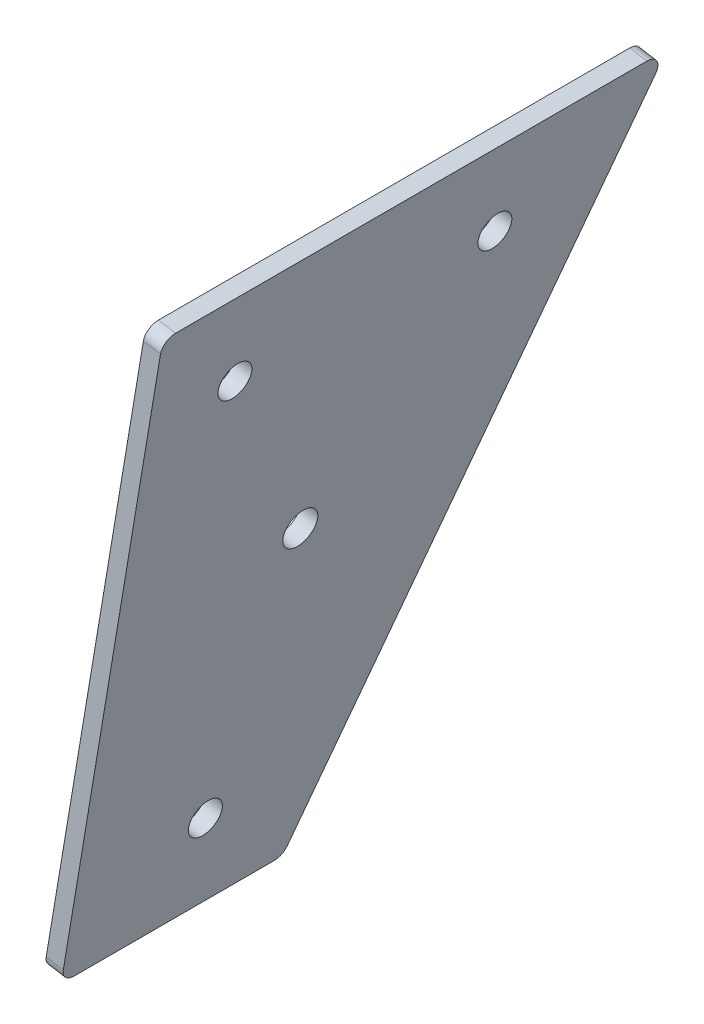
ISO-10303-21;
HEADER;
FILE_DESCRIPTION(('STEP AP214'),'2;1');
FILE_NAME('part.step','',(''),(''),'','','');
FILE_SCHEMA(('AUTOMOTIVE_DESIGN { 1 0 10303 214 1 1 1 1 }'));
ENDSEC;
DATA;
#1=APPLICATION_CONTEXT('core data for automotive mechanical design processes');
#2=APPLICATION_PROTOCOL_DEFINITION('international standard','automotive_design',2000,#1);
#3=PRODUCT_CONTEXT('',#1,'mechanical');
#4=PRODUCT('Part','Part','',(#3));
#5=PRODUCT_RELATED_PRODUCT_CATEGORY('part','',(#4));
#6=PRODUCT_DEFINITION_FORMATION('','',#4);
#7=PRODUCT_DEFINITION_CONTEXT('part definition',#1,'design');
#8=PRODUCT_DEFINITION('design','',#6,#7);
#9=PRODUCT_DEFINITION_SHAPE('','',#8);
#10=(LENGTH_UNIT() NAMED_UNIT(*) SI_UNIT(.MILLI.,.METRE.));
#11=(NAMED_UNIT(*) PLANE_ANGLE_UNIT() SI_UNIT($,.RADIAN.));
#12=(NAMED_UNIT(*) SI_UNIT($,.STERADIAN.) SOLID_ANGLE_UNIT());
#13=UNCERTAINTY_MEASURE_WITH_UNIT(LENGTH_MEASURE(1.E-05),#10,'distance_accuracy_value','');
#14=(GEOMETRIC_REPRESENTATION_CONTEXT(3) GLOBAL_UNCERTAINTY_ASSIGNED_CONTEXT((#13)) GLOBAL_UNIT_ASSIGNED_CONTEXT((#10,
#11,#12)) REPRESENTATION_CONTEXT('',''));
#15=CARTESIAN_POINT('',(0.,0.,0.));
#16=DIRECTION('',(0.,0.,1.));
#17=DIRECTION('',(1.,0.,0.));
#18=AXIS2_PLACEMENT_3D('',#15,#16,#17);
#19=CARTESIAN_POINT('',(72.9777924943383,-12.18714626148,0.));
#20=DIRECTION('',(-0.986340874840536,0.164716965182117,0.));
#21=DIRECTION('',(-0.164716965182117,-0.986340874840536,0.));
#22=AXIS2_PLACEMENT_3D('',#19,#20,#21);
#23=PLANE('',#22);
#24=DIRECTION('',(0.149647295391109,0.896102256925328,-0.417859344894259));
#25=VECTOR('',#24,1.);
#26=CARTESIAN_POINT('',(90.4601382261699,92.4988049660353,-65.3954656123155));
#27=LINE('',#26,#25);
#28=CARTESIAN_POINT('',(67.3278305893085,-46.0196562404083,-0.803246355904688));
#29=VERTEX_POINT('',#28);
#30=CARTESIAN_POINT('',(89.7595017611316,88.3033270861038,-63.4390821472836));
#31=VERTEX_POINT('',#30);
#32=EDGE_CURVE('E123',#29,#31,#27,.T.);
#33=ORIENTED_EDGE('',*,*,#32,.T.);
#34=CARTESIAN_POINT('',(89.9659873306235,89.5397823415136,-60.713546950123));
#35=DIRECTION('',(-0.986340874840536,0.164716965182117,0.));
#36=DIRECTION('',(-0.164716965182117,-0.986340874840536,0.));
#37=AXIS2_PLACEMENT_3D('',#34,#35,#36);
#38=CIRCLE('',#37,3.);
#39=CARTESIAN_POINT('',(90.4601382261699,92.4988049660353,-60.713546950123));
#40=VERTEX_POINT('',#39);
#41=EDGE_CURVE('E48',#31,#40,#38,.F.);
#42=ORIENTED_EDGE('',*,*,#41,.T.);
#43=DIRECTION('',(0.,0.,1.));
#44=VECTOR('',#43,1.);
#45=CARTESIAN_POINT('',(90.4601382261699,92.4988049660353,51.1));
#46=LINE('',#45,#44);
#47=CARTESIAN_POINT('',(90.4601382261699,92.4988049660353,48.1));
#48=VERTEX_POINT('',#47);
#49=EDGE_CURVE('E124',#40,#48,#46,.T.);
#50=ORIENTED_EDGE('',*,*,#49,.T.);
#51=CARTESIAN_POINT('',(89.9659873306235,89.5397823415137,48.1));
#52=DIRECTION('',(-0.986340874840536,0.164716965182117,0.));
#53=DIRECTION('',(-0.164716965182117,-0.986340874840536,0.));
#54=AXIS2_PLACEMENT_3D('',#51,#52,#53);
#55=CIRCLE('',#54,3.);
#56=CARTESIAN_POINT('',(89.9659873306235,89.5397823415137,51.1));
#57=VERTEX_POINT('',#56);
#58=EDGE_CURVE('E55',#48,#57,#55,.F.);
#59=ORIENTED_EDGE('',*,*,#58,.T.);
#60=DIRECTION('',(-0.164716965182117,-0.986340874840536,0.));
#61=VECTOR('',#60,1.);
#62=CARTESIAN_POINT('',(67.0401652632541,-47.74222360952,51.1));
#63=LINE('',#62,#61);
#64=CARTESIAN_POINT('',(67.5343161588004,-44.7832009849984,51.1));
#65=VERTEX_POINT('',#64);
#66=EDGE_CURVE('E134',#57,#65,#63,.T.);
#67=ORIENTED_EDGE('',*,*,#66,.T.);
#68=CARTESIAN_POINT('',(67.5343161588004,-44.7832009849984,48.1));
#69=DIRECTION('',(-0.986340874840536,0.164716965182117,0.));
#70=DIRECTION('',(-0.164716965182117,-0.986340874840536,0.));
#71=AXIS2_PLACEMENT_3D('',#68,#69,#70);
#72=CIRCLE('',#71,3.);
#73=CARTESIAN_POINT('',(67.0401652632541,-47.74222360952,48.1));
#74=VERTEX_POINT('',#73);
#75=EDGE_CURVE('E145',#65,#74,#72,.F.);
#76=ORIENTED_EDGE('',*,*,#75,.T.);
#77=DIRECTION('',(0.,0.,-1.));
#78=VECTOR('',#77,1.);
#79=CARTESIAN_POINT('',(67.0401652632541,-47.74222360952,0.));
#80=LINE('',#79,#78);
#81=CARTESIAN_POINT('',(67.0401652632541,-47.74222360952,1.92228884125582));
#82=VERTEX_POINT('',#81);
#83=EDGE_CURVE('E247',#74,#82,#80,.T.);
#84=ORIENTED_EDGE('',*,*,#83,.T.);
#85=CARTESIAN_POINT('',(67.5343161588004,-44.7832009849984,1.92228884125582));
#86=DIRECTION('',(-0.986340874840536,0.164716965182117,0.));
#87=DIRECTION('',(-0.164716965182117,-0.986340874840536,0.));
#88=AXIS2_PLACEMENT_3D('',#85,#86,#87);
#89=CIRCLE('',#88,3.);
#90=EDGE_CURVE('E147',#82,#29,#89,.F.);
#91=ORIENTED_EDGE('',*,*,#90,.T.);
#92=EDGE_LOOP('',(#33,#42,#50,#59,#67,#76,#84,#91));
#93=FACE_BOUND('',#92,.T.);
#94=CARTESIAN_POINT('',(87.1657989225275,72.7719874692245,31.1));
#95=DIRECTION('',(0.986340874840536,-0.164716965182117,0.));
#96=DIRECTION('',(0.164716965182117,0.986340874840536,0.));
#97=AXIS2_PLACEMENT_3D('',#94,#95,#96);
#98=CIRCLE('',#97,3.87500000000002);
#99=CARTESIAN_POINT('',(87.8040771626082,76.5940583592316,31.1));
#100=VERTEX_POINT('',#99);
#101=EDGE_CURVE('E241',#100,#100,#98,.T.);
#102=ORIENTED_EDGE('',*,*,#101,.F.);
#103=EDGE_LOOP('',(#102));
#104=FACE_BOUND('',#103,.T.);
#105=CARTESIAN_POINT('',(87.1657989225275,72.7719874692245,-28.9));
#106=DIRECTION('',(0.986340874840536,-0.164716965182117,0.));
#107=DIRECTION('',(0.164716965182117,0.986340874840536,0.));
#108=AXIS2_PLACEMENT_3D('',#105,#106,#107);
#109=CIRCLE('',#108,3.87500000000002);
#110=CARTESIAN_POINT('',(87.8040771626082,76.5940583592316,-28.9));
#111=VERTEX_POINT('',#110);
#112=EDGE_CURVE('E228',#111,#111,#109,.T.);
#113=ORIENTED_EDGE('',*,*,#112,.F.);
#114=EDGE_LOOP('',(#113));
#115=FACE_BOUND('',#114,.T.);
#116=CARTESIAN_POINT('',(79.7535354893322,28.3866481014004,8.6));
#117=DIRECTION('',(0.986340874840536,-0.164716965182117,0.));
#118=DIRECTION('',(0.164716965182117,0.986340874840536,0.));
#119=AXIS2_PLACEMENT_3D('',#116,#117,#118);
#120=CIRCLE('',#119,4.00000000000001);
#121=CARTESIAN_POINT('',(80.4124033500607,32.3320116007626,8.6));
#122=VERTEX_POINT('',#121);
#123=EDGE_CURVE('E232',#122,#122,#120,.T.);
#124=ORIENTED_EDGE('',*,*,#123,.F.);
#125=EDGE_LOOP('',(#124));
#126=FACE_BOUND('',#125,.T.);
#127=CARTESIAN_POINT('',(70.3345045668964,-28.0154061127092,21.1));
#128=DIRECTION('',(0.986340874840536,-0.164716965182117,0.));
#129=DIRECTION('',(0.164716965182117,0.986340874840536,0.));
#130=AXIS2_PLACEMENT_3D('',#127,#128,#129);
#131=CIRCLE('',#130,3.875);
#132=CARTESIAN_POINT('',(70.9727828069771,-24.1933352227022,21.1));
#133=VERTEX_POINT('',#132);
#134=EDGE_CURVE('E265',#133,#133,#131,.T.);
#135=ORIENTED_EDGE('',*,*,#134,.F.);
#136=EDGE_LOOP('',(#135));
#137=FACE_BOUND('',#136,.T.);
#138=ADVANCED_FACE('F40',(#93,#104,#115,#126,#137),#23,.F.);
#139=CARTESIAN_POINT('',(69.0324289949762,-11.5282784007515,0.));
#140=DIRECTION('',(-0.986340874840536,0.164716965182117,0.));
#141=DIRECTION('',(-0.164716965182117,-0.986340874840536,0.));
#142=AXIS2_PLACEMENT_3D('',#139,#140,#141);
#143=PLANE('',#142);
#144=CARTESIAN_POINT('',(75.8081719899701,29.0455159621289,8.6));
#145=DIRECTION('',(0.986340874840536,-0.164716965182117,0.));
#146=DIRECTION('',(0.164716965182117,0.986340874840536,0.));
#147=AXIS2_PLACEMENT_3D('',#144,#145,#146);
#148=CIRCLE('',#147,4.00000000000001);
#149=CARTESIAN_POINT('',(76.4670398506986,32.990879461491,8.6));
#150=VERTEX_POINT('',#149);
#151=EDGE_CURVE('E237',#150,#150,#148,.T.);
#152=ORIENTED_EDGE('',*,*,#151,.T.);
#153=EDGE_LOOP('',(#152));
#154=FACE_BOUND('',#153,.T.);
#155=CARTESIAN_POINT('',(83.2204354231654,73.430855329953,31.1));
#156=DIRECTION('',(0.986340874840536,-0.164716965182117,0.));
#157=DIRECTION('',(0.164716965182117,0.986340874840536,0.));
#158=AXIS2_PLACEMENT_3D('',#155,#156,#157);
#159=CIRCLE('',#158,3.87500000000002);
#160=CARTESIAN_POINT('',(83.8587136632461,77.2529262199601,31.1));
#161=VERTEX_POINT('',#160);
#162=EDGE_CURVE('E234',#161,#161,#159,.T.);
#163=ORIENTED_EDGE('',*,*,#162,.T.);
#164=EDGE_LOOP('',(#163));
#165=FACE_BOUND('',#164,.T.);
#166=DIRECTION('',(0.,0.,1.));
#167=VECTOR('',#166,1.);
#168=CARTESIAN_POINT('',(86.5147747268077,93.1576728267637,51.1));
#169=LINE('',#168,#167);
#170=CARTESIAN_POINT('',(86.5147747268077,93.1576728267637,-60.713546950123));
#171=VERTEX_POINT('',#170);
#172=CARTESIAN_POINT('',(86.5147747268077,93.1576728267637,48.1));
#173=VERTEX_POINT('',#172);
#174=EDGE_CURVE('E130',#171,#173,#169,.T.);
#175=ORIENTED_EDGE('',*,*,#174,.F.);
#176=CARTESIAN_POINT('',(86.0206238312614,90.1986502022421,-60.713546950123));
#177=DIRECTION('',(-0.986340874840536,0.164716965182117,0.));
#178=DIRECTION('',(-0.164716965182117,-0.986340874840536,0.));
#179=AXIS2_PLACEMENT_3D('',#176,#177,#178);
#180=CIRCLE('',#179,3.);
#181=CARTESIAN_POINT('',(85.8141382617695,88.9621949468322,-63.4390821472836));
#182=VERTEX_POINT('',#181);
#183=EDGE_CURVE('E129',#171,#182,#180,.T.);
#184=ORIENTED_EDGE('',*,*,#183,.T.);
#185=DIRECTION('',(0.149647295391109,0.896102256925328,-0.417859344894259));
#186=VECTOR('',#185,1.);
#187=CARTESIAN_POINT('',(86.5147747268077,93.1576728267637,-65.3954656123155));
#188=LINE('',#187,#186);
#189=CARTESIAN_POINT('',(63.3824670899464,-45.3607883796798,-0.803246355904688));
#190=VERTEX_POINT('',#189);
#191=EDGE_CURVE('E122',#190,#182,#188,.T.);
#192=ORIENTED_EDGE('',*,*,#191,.F.);
#193=CARTESIAN_POINT('',(63.5889526594383,-44.1243331242699,1.92228884125582));
#194=DIRECTION('',(-0.986340874840536,0.164716965182117,0.));
#195=DIRECTION('',(-0.164716965182117,-0.986340874840536,0.));
#196=AXIS2_PLACEMENT_3D('',#193,#194,#195);
#197=CIRCLE('',#196,3.);
#198=CARTESIAN_POINT('',(63.0948017638919,-47.0833557487915,1.92228884125582));
#199=VERTEX_POINT('',#198);
#200=EDGE_CURVE('E108',#190,#199,#197,.T.);
#201=ORIENTED_EDGE('',*,*,#200,.T.);
#202=DIRECTION('',(0.,0.,-1.));
#203=VECTOR('',#202,1.);
#204=CARTESIAN_POINT('',(63.0948017638919,-47.0833557487915,0.));
#205=LINE('',#204,#203);
#206=CARTESIAN_POINT('',(63.0948017638919,-47.0833557487915,48.1));
#207=VERTEX_POINT('',#206);
#208=EDGE_CURVE('E131',#207,#199,#205,.T.);
#209=ORIENTED_EDGE('',*,*,#208,.F.);
#210=CARTESIAN_POINT('',(63.5889526594383,-44.1243331242699,48.1));
#211=DIRECTION('',(-0.986340874840536,0.164716965182117,0.));
#212=DIRECTION('',(-0.164716965182117,-0.986340874840536,0.));
#213=AXIS2_PLACEMENT_3D('',#210,#211,#212);
#214=CIRCLE('',#213,3.);
#215=CARTESIAN_POINT('',(63.5889526594383,-44.1243331242699,51.1));
#216=VERTEX_POINT('',#215);
#217=EDGE_CURVE('E119',#207,#216,#214,.T.);
#218=ORIENTED_EDGE('',*,*,#217,.T.);
#219=DIRECTION('',(-0.164716965182117,-0.986340874840536,0.));
#220=VECTOR('',#219,1.);
#221=CARTESIAN_POINT('',(63.0948017638919,-47.0833557487915,51.1));
#222=LINE('',#221,#220);
#223=CARTESIAN_POINT('',(86.0206238312614,90.1986502022422,51.1));
#224=VERTEX_POINT('',#223);
#225=EDGE_CURVE('E136',#224,#216,#222,.T.);
#226=ORIENTED_EDGE('',*,*,#225,.F.);
#227=CARTESIAN_POINT('',(86.0206238312614,90.1986502022421,48.1));
#228=DIRECTION('',(-0.986340874840536,0.164716965182117,0.));
#229=DIRECTION('',(-0.164716965182117,-0.986340874840536,0.));
#230=AXIS2_PLACEMENT_3D('',#227,#228,#229);
#231=CIRCLE('',#230,3.);
#232=EDGE_CURVE('E157',#224,#173,#231,.T.);
#233=ORIENTED_EDGE('',*,*,#232,.T.);
#234=EDGE_LOOP('',(#175,#184,#192,#201,#209,#218,#226,#233));
#235=FACE_BOUND('',#234,.T.);
#236=CARTESIAN_POINT('',(83.2204354231654,73.430855329953,-28.9));
#237=DIRECTION('',(0.986340874840536,-0.164716965182117,0.));
#238=DIRECTION('',(0.164716965182117,0.986340874840536,0.));
#239=AXIS2_PLACEMENT_3D('',#236,#237,#238);
#240=CIRCLE('',#239,3.87500000000002);
#241=CARTESIAN_POINT('',(83.8587136632461,77.2529262199601,-28.9));
#242=VERTEX_POINT('',#241);
#243=EDGE_CURVE('E231',#242,#242,#240,.T.);
#244=ORIENTED_EDGE('',*,*,#243,.T.);
#245=EDGE_LOOP('',(#244));
#246=FACE_BOUND('',#245,.T.);
#247=CARTESIAN_POINT('',(66.3891410675343,-27.3565382519808,21.1));
#248=DIRECTION('',(0.986340874840536,-0.164716965182117,0.));
#249=DIRECTION('',(0.164716965182117,0.986340874840536,0.));
#250=AXIS2_PLACEMENT_3D('',#247,#248,#249);
#251=CIRCLE('',#250,3.875);
#252=CARTESIAN_POINT('',(67.027419307615,-23.5344673619737,21.1));
#253=VERTEX_POINT('',#252);
#254=EDGE_CURVE('E266',#253,#253,#251,.T.);
#255=ORIENTED_EDGE('',*,*,#254,.T.);
#256=EDGE_LOOP('',(#255));
#257=FACE_BOUND('',#256,.T.);
#258=ADVANCED_FACE('F127',(#154,#165,#235,#246,#257),#143,.T.);
#259=CARTESIAN_POINT('',(67.0401652632541,-47.74222360952,51.1));
#260=DIRECTION('',(0.,0.,-1.));
#261=DIRECTION('',(-1.,0.,0.));
#262=AXIS2_PLACEMENT_3D('',#259,#260,#261);
#263=PLANE('',#262);
#264=ORIENTED_EDGE('',*,*,#66,.F.);
#265=DIRECTION('',(-0.986340874840536,0.164716965182117,0.));
#266=VECTOR('',#265,1.);
#267=CARTESIAN_POINT('',(89.9659873306235,89.5397823415136,51.1));
#268=LINE('',#267,#266);
#269=EDGE_CURVE('E11',#57,#224,#268,.T.);
#270=ORIENTED_EDGE('',*,*,#269,.T.);
#271=ORIENTED_EDGE('',*,*,#225,.T.);
#272=DIRECTION('',(-0.986340874840536,0.164716965182117,0.));
#273=VECTOR('',#272,1.);
#274=CARTESIAN_POINT('',(67.5343161588004,-44.7832009849984,51.1));
#275=LINE('',#274,#273);
#276=EDGE_CURVE('E149',#216,#65,#275,.F.);
#277=ORIENTED_EDGE('',*,*,#276,.T.);
#278=EDGE_LOOP('',(#264,#270,#271,#277));
#279=FACE_BOUND('',#278,.T.);
#280=ADVANCED_FACE('F185',(#279),#263,.F.);
#281=CARTESIAN_POINT('',(67.0401652632541,-47.74222360952,0.));
#282=DIRECTION('',(0.164716965182117,0.986340874840536,0.));
#283=DIRECTION('',(-0.986340874840536,0.164716965182117,0.));
#284=AXIS2_PLACEMENT_3D('',#281,#282,#283);
#285=PLANE('',#284);
#286=ORIENTED_EDGE('',*,*,#208,.T.);
#287=DIRECTION('',(-0.986340874840536,0.164716965182117,0.));
#288=VECTOR('',#287,1.);
#289=CARTESIAN_POINT('',(67.0401652632541,-47.74222360952,1.92228884125582));
#290=LINE('',#289,#288);
#291=EDGE_CURVE('E113',#199,#82,#290,.F.);
#292=ORIENTED_EDGE('',*,*,#291,.T.);
#293=ORIENTED_EDGE('',*,*,#83,.F.);
#294=DIRECTION('',(-0.986340874840536,0.164716965182117,0.));
#295=VECTOR('',#294,1.);
#296=CARTESIAN_POINT('',(67.0401652632541,-47.74222360952,48.1));
#297=LINE('',#296,#295);
#298=EDGE_CURVE('E118',#74,#207,#297,.T.);
#299=ORIENTED_EDGE('',*,*,#298,.T.);
#300=EDGE_LOOP('',(#286,#292,#293,#299));
#301=FACE_BOUND('',#300,.T.);
#302=ADVANCED_FACE('F196',(#301),#285,.F.);
#303=CARTESIAN_POINT('',(90.4601382261699,92.4988049660353,-65.3954656123155));
#304=DIRECTION('',(0.0688285231639701,0.412151751803297,0.908511732386842));
#305=DIRECTION('',(0.,-0.910671384835247,0.413131490983503));
#306=AXIS2_PLACEMENT_3D('',#303,#304,#305);
#307=PLANE('',#306);
#308=ORIENTED_EDGE('',*,*,#191,.T.);
#309=DIRECTION('',(-0.986340874840536,0.164716965182117,0.));
#310=VECTOR('',#309,1.);
#311=CARTESIAN_POINT('',(89.7595017611316,88.3033270861038,-63.4390821472836));
#312=LINE('',#311,#310);
#313=EDGE_CURVE('E63',#182,#31,#312,.F.);
#314=ORIENTED_EDGE('',*,*,#313,.T.);
#315=ORIENTED_EDGE('',*,*,#32,.F.);
#316=DIRECTION('',(-0.986340874840536,0.164716965182117,0.));
#317=VECTOR('',#316,1.);
#318=CARTESIAN_POINT('',(67.3278305893085,-46.0196562404083,-0.803246355904688));
#319=LINE('',#318,#317);
#320=EDGE_CURVE('E112',#29,#190,#319,.T.);
#321=ORIENTED_EDGE('',*,*,#320,.T.);
#322=EDGE_LOOP('',(#308,#314,#315,#321));
#323=FACE_BOUND('',#322,.T.);
#324=ADVANCED_FACE('F121',(#323),#307,.F.);
#325=CARTESIAN_POINT('',(90.4601382261699,92.4988049660353,51.1));
#326=DIRECTION('',(-0.164716965182117,-0.986340874840536,0.));
#327=DIRECTION('',(0.986340874840536,-0.164716965182117,0.));
#328=AXIS2_PLACEMENT_3D('',#325,#326,#327);
#329=PLANE('',#328);
#330=ORIENTED_EDGE('',*,*,#49,.F.);
#331=DIRECTION('',(-0.986340874840536,0.164716965182117,0.));
#332=VECTOR('',#331,1.);
#333=CARTESIAN_POINT('',(90.4601382261699,92.4988049660353,-60.713546950123));
#334=LINE('',#333,#332);
#335=EDGE_CURVE('E154',#40,#171,#334,.T.);
#336=ORIENTED_EDGE('',*,*,#335,.T.);
#337=ORIENTED_EDGE('',*,*,#174,.T.);
#338=DIRECTION('',(-0.986340874840536,0.164716965182117,0.));
#339=VECTOR('',#338,1.);
#340=CARTESIAN_POINT('',(90.4601382261699,92.4988049660353,48.1));
#341=LINE('',#340,#339);
#342=EDGE_CURVE('E152',#173,#48,#341,.F.);
#343=ORIENTED_EDGE('',*,*,#342,.T.);
#344=EDGE_LOOP('',(#330,#336,#337,#343));
#345=FACE_BOUND('',#344,.T.);
#346=ADVANCED_FACE('F167',(#345),#329,.F.);
#347=CARTESIAN_POINT('',(87.1657989225275,72.7719874692245,31.1));
#348=DIRECTION('',(-0.986340874840536,0.164716965182117,0.));
#349=DIRECTION('',(-0.164716965182117,-0.986340874840536,0.));
#350=AXIS2_PLACEMENT_3D('',#347,#348,#349);
#351=CYLINDRICAL_SURFACE('',#350,3.87500000000002);
#352=ORIENTED_EDGE('',*,*,#101,.T.);
#353=EDGE_LOOP('',(#352));
#354=FACE_BOUND('',#353,.T.);
#355=ORIENTED_EDGE('',*,*,#162,.F.);
#356=EDGE_LOOP('',(#355));
#357=FACE_BOUND('',#356,.T.);
#358=ADVANCED_FACE('F189',(#354,#357),#351,.F.);
#359=CARTESIAN_POINT('',(87.1657989225275,72.7719874692245,-28.9));
#360=DIRECTION('',(-0.986340874840536,0.164716965182117,0.));
#361=DIRECTION('',(-0.164716965182117,-0.986340874840536,0.));
#362=AXIS2_PLACEMENT_3D('',#359,#360,#361);
#363=CYLINDRICAL_SURFACE('',#362,3.87500000000002);
#364=ORIENTED_EDGE('',*,*,#112,.T.);
#365=EDGE_LOOP('',(#364));
#366=FACE_BOUND('',#365,.T.);
#367=ORIENTED_EDGE('',*,*,#243,.F.);
#368=EDGE_LOOP('',(#367));
#369=FACE_BOUND('',#368,.T.);
#370=ADVANCED_FACE('F214',(#366,#369),#363,.F.);
#371=CARTESIAN_POINT('',(79.7535354893322,28.3866481014004,8.6));
#372=DIRECTION('',(-0.986340874840536,0.164716965182117,0.));
#373=DIRECTION('',(-0.164716965182117,-0.986340874840536,0.));
#374=AXIS2_PLACEMENT_3D('',#371,#372,#373);
#375=CYLINDRICAL_SURFACE('',#374,4.00000000000001);
#376=ORIENTED_EDGE('',*,*,#123,.T.);
#377=EDGE_LOOP('',(#376));
#378=FACE_BOUND('',#377,.T.);
#379=ORIENTED_EDGE('',*,*,#151,.F.);
#380=EDGE_LOOP('',(#379));
#381=FACE_BOUND('',#380,.T.);
#382=ADVANCED_FACE('F208',(#378,#381),#375,.F.);
#383=CARTESIAN_POINT('',(70.3345045668964,-28.0154061127092,21.1));
#384=DIRECTION('',(-0.986340874840536,0.164716965182117,0.));
#385=DIRECTION('',(-0.164716965182117,-0.986340874840536,0.));
#386=AXIS2_PLACEMENT_3D('',#383,#384,#385);
#387=CYLINDRICAL_SURFACE('',#386,3.875);
#388=ORIENTED_EDGE('',*,*,#134,.T.);
#389=EDGE_LOOP('',(#388));
#390=FACE_BOUND('',#389,.T.);
#391=ORIENTED_EDGE('',*,*,#254,.F.);
#392=EDGE_LOOP('',(#391));
#393=FACE_BOUND('',#392,.T.);
#394=ADVANCED_FACE('F204',(#390,#393),#387,.F.);
#395=CARTESIAN_POINT('',(67.5343161588004,-44.7832009849984,1.92228884125582));
#396=DIRECTION('',(-0.986340874840536,0.164716965182117,0.));
#397=DIRECTION('',(-0.164716965182117,-0.986340874840536,0.));
#398=AXIS2_PLACEMENT_3D('',#395,#396,#397);
#399=CYLINDRICAL_SURFACE('',#398,3.);
#400=ORIENTED_EDGE('',*,*,#90,.F.);
#401=ORIENTED_EDGE('',*,*,#291,.F.);
#402=ORIENTED_EDGE('',*,*,#200,.F.);
#403=ORIENTED_EDGE('',*,*,#320,.F.);
#404=EDGE_LOOP('',(#400,#401,#402,#403));
#405=FACE_BOUND('',#404,.T.);
#406=ADVANCED_FACE('F111',(#405),#399,.T.);
#407=CARTESIAN_POINT('',(67.5343161588004,-44.7832009849984,48.1));
#408=DIRECTION('',(-0.986340874840536,0.164716965182117,0.));
#409=DIRECTION('',(-0.164716965182117,-0.986340874840536,0.));
#410=AXIS2_PLACEMENT_3D('',#407,#408,#409);
#411=CYLINDRICAL_SURFACE('',#410,3.);
#412=ORIENTED_EDGE('',*,*,#75,.F.);
#413=ORIENTED_EDGE('',*,*,#276,.F.);
#414=ORIENTED_EDGE('',*,*,#217,.F.);
#415=ORIENTED_EDGE('',*,*,#298,.F.);
#416=EDGE_LOOP('',(#412,#413,#414,#415));
#417=FACE_BOUND('',#416,.T.);
#418=ADVANCED_FACE('F172',(#417),#411,.T.);
#419=CARTESIAN_POINT('',(89.9659873306235,89.5397823415136,-60.713546950123));
#420=DIRECTION('',(-0.986340874840536,0.164716965182117,0.));
#421=DIRECTION('',(-0.164716965182117,-0.986340874840536,0.));
#422=AXIS2_PLACEMENT_3D('',#419,#420,#421);
#423=CYLINDRICAL_SURFACE('',#422,3.);
#424=ORIENTED_EDGE('',*,*,#41,.F.);
#425=ORIENTED_EDGE('',*,*,#313,.F.);
#426=ORIENTED_EDGE('',*,*,#183,.F.);
#427=ORIENTED_EDGE('',*,*,#335,.F.);
#428=EDGE_LOOP('',(#424,#425,#426,#427));
#429=FACE_BOUND('',#428,.T.);
#430=ADVANCED_FACE('F170',(#429),#423,.T.);
#431=CARTESIAN_POINT('',(89.9659873306235,89.5397823415137,48.1));
#432=DIRECTION('',(-0.986340874840536,0.164716965182117,0.));
#433=DIRECTION('',(-0.164716965182117,-0.986340874840536,0.));
#434=AXIS2_PLACEMENT_3D('',#431,#432,#433);
#435=CYLINDRICAL_SURFACE('',#434,3.);
#436=ORIENTED_EDGE('',*,*,#58,.F.);
#437=ORIENTED_EDGE('',*,*,#342,.F.);
#438=ORIENTED_EDGE('',*,*,#232,.F.);
#439=ORIENTED_EDGE('',*,*,#269,.F.);
#440=EDGE_LOOP('',(#436,#437,#438,#439));
#441=FACE_BOUND('',#440,.T.);
#442=ADVANCED_FACE('F42',(#441),#435,.T.);
#443=CLOSED_SHELL('',(#138,#258,#280,#302,#324,#346,#358,#370,#382,#394,#406,#418,#430,#442));
#444=MANIFOLD_SOLID_BREP('B2',#443);
#445=ADVANCED_BREP_SHAPE_REPRESENTATION('',(#18,#444),#14);
#446=SHAPE_DEFINITION_REPRESENTATION(#9,#445);
ENDSEC;
END-ISO-10303-21;
